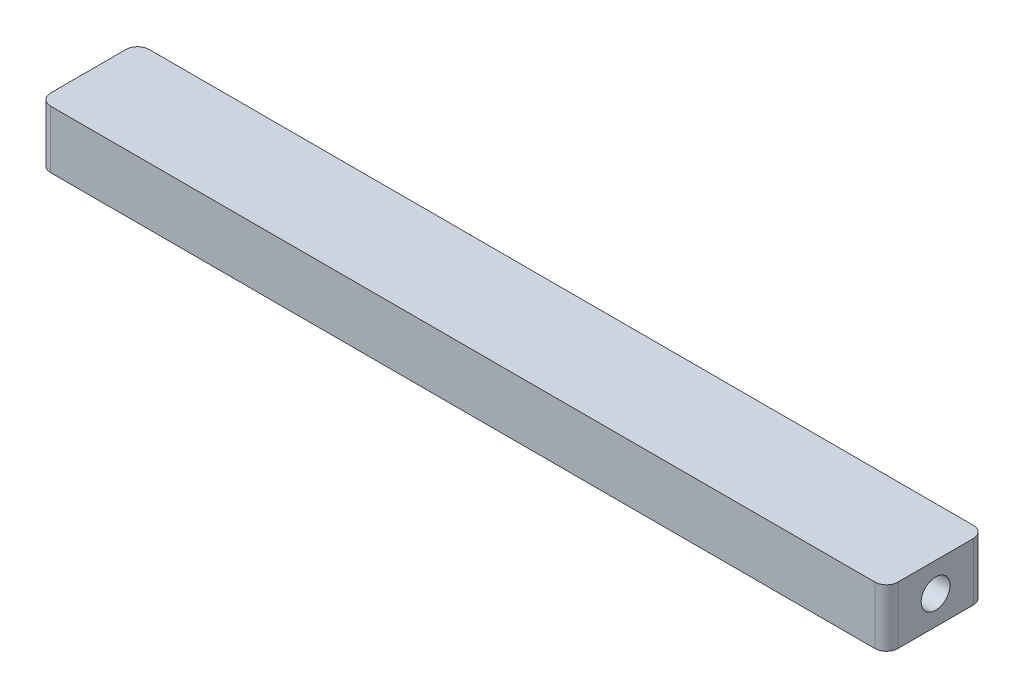
ISO-10303-21;
HEADER;
FILE_DESCRIPTION(('STEP AP214'),'2;1');
FILE_NAME('part.step','',(''),(''),'','','');
FILE_SCHEMA(('AUTOMOTIVE_DESIGN { 1 0 10303 214 1 1 1 1 }'));
ENDSEC;
DATA;
#1=APPLICATION_CONTEXT('core data for automotive mechanical design processes');
#2=APPLICATION_PROTOCOL_DEFINITION('international standard','automotive_design',2000,#1);
#3=PRODUCT_CONTEXT('',#1,'mechanical');
#4=PRODUCT('Part','Part','',(#3));
#5=PRODUCT_RELATED_PRODUCT_CATEGORY('part','',(#4));
#6=PRODUCT_DEFINITION_FORMATION('','',#4);
#7=PRODUCT_DEFINITION_CONTEXT('part definition',#1,'design');
#8=PRODUCT_DEFINITION('design','',#6,#7);
#9=PRODUCT_DEFINITION_SHAPE('','',#8);
#10=(LENGTH_UNIT() NAMED_UNIT(*) SI_UNIT(.MILLI.,.METRE.));
#11=(NAMED_UNIT(*) PLANE_ANGLE_UNIT() SI_UNIT($,.RADIAN.));
#12=(NAMED_UNIT(*) SI_UNIT($,.STERADIAN.) SOLID_ANGLE_UNIT());
#13=UNCERTAINTY_MEASURE_WITH_UNIT(LENGTH_MEASURE(1.E-05),#10,'distance_accuracy_value','');
#14=(GEOMETRIC_REPRESENTATION_CONTEXT(3) GLOBAL_UNCERTAINTY_ASSIGNED_CONTEXT((#13)) GLOBAL_UNIT_ASSIGNED_CONTEXT((#10,
#11,#12)) REPRESENTATION_CONTEXT('',''));
#15=CARTESIAN_POINT('',(0.,0.,0.));
#16=DIRECTION('',(0.,0.,1.));
#17=DIRECTION('',(1.,0.,0.));
#18=AXIS2_PLACEMENT_3D('',#15,#16,#17);
#19=CARTESIAN_POINT('',(94.3013227790023,10.,-32.2251416702218));
#20=DIRECTION('',(0.,-1.,0.));
#21=DIRECTION('',(0.,0.,-1.));
#22=AXIS2_PLACEMENT_3D('',#19,#20,#21);
#23=CYLINDRICAL_SURFACE('',#22,2.);
#24=CARTESIAN_POINT('',(94.3013227790023,0.,-32.2251416702218));
#25=DIRECTION('',(0.,1.,0.));
#26=DIRECTION('',(0.,0.,1.));
#27=AXIS2_PLACEMENT_3D('',#24,#25,#26);
#28=CIRCLE('',#27,2.);
#29=CARTESIAN_POINT('',(96.3013227790023,0.,-32.2251416702218));
#30=VERTEX_POINT('',#29);
#31=CARTESIAN_POINT('',(94.3013227790023,0.,-34.2251416702218));
#32=VERTEX_POINT('',#31);
#33=EDGE_CURVE('E129',#30,#32,#28,.T.);
#34=ORIENTED_EDGE('',*,*,#33,.T.);
#35=DIRECTION('',(0.,-1.,0.));
#36=VECTOR('',#35,1.);
#37=CARTESIAN_POINT('',(94.3013227790023,10.,-34.2251416702218));
#38=LINE('',#37,#36);
#39=CARTESIAN_POINT('',(94.3013227790023,10.,-34.2251416702218));
#40=VERTEX_POINT('',#39);
#41=EDGE_CURVE('E11',#40,#32,#38,.T.);
#42=ORIENTED_EDGE('',*,*,#41,.F.);
#43=CARTESIAN_POINT('',(94.3013227790023,10.,-32.2251416702218));
#44=DIRECTION('',(0.,1.,0.));
#45=DIRECTION('',(0.,0.,1.));
#46=AXIS2_PLACEMENT_3D('',#43,#44,#45);
#47=CIRCLE('',#46,2.);
#48=CARTESIAN_POINT('',(96.3013227790023,10.,-32.2251416702218));
#49=VERTEX_POINT('',#48);
#50=EDGE_CURVE('E144',#49,#40,#47,.T.);
#51=ORIENTED_EDGE('',*,*,#50,.F.);
#52=DIRECTION('',(0.,-1.,0.));
#53=VECTOR('',#52,1.);
#54=CARTESIAN_POINT('',(96.3013227790023,10.,-32.2251416702218));
#55=LINE('',#54,#53);
#56=EDGE_CURVE('E125',#49,#30,#55,.T.);
#57=ORIENTED_EDGE('',*,*,#56,.T.);
#58=EDGE_LOOP('',(#34,#42,#51,#57));
#59=FACE_BOUND('',#58,.T.);
#60=ADVANCED_FACE('F33',(#59),#23,.T.);
#61=CARTESIAN_POINT('',(-48.7697450328632,10.,-34.2251416702218));
#62=DIRECTION('',(0.,0.,1.));
#63=DIRECTION('',(1.,0.,0.));
#64=AXIS2_PLACEMENT_3D('',#61,#62,#63);
#65=PLANE('',#64);
#66=DIRECTION('',(-1.,0.,0.));
#67=VECTOR('',#66,1.);
#68=CARTESIAN_POINT('',(-48.7697450328632,0.,-34.2251416702218));
#69=LINE('',#68,#67);
#70=CARTESIAN_POINT('',(-48.7697450328632,0.,-34.2251416702218));
#71=VERTEX_POINT('',#70);
#72=EDGE_CURVE('E132',#32,#71,#69,.T.);
#73=ORIENTED_EDGE('',*,*,#72,.T.);
#74=DIRECTION('',(0.,-1.,0.));
#75=VECTOR('',#74,1.);
#76=CARTESIAN_POINT('',(-48.7697450328632,10.,-34.2251416702218));
#77=LINE('',#76,#75);
#78=CARTESIAN_POINT('',(-48.7697450328632,10.,-34.2251416702218));
#79=VERTEX_POINT('',#78);
#80=EDGE_CURVE('E41',#79,#71,#77,.T.);
#81=ORIENTED_EDGE('',*,*,#80,.F.);
#82=DIRECTION('',(-1.,0.,0.));
#83=VECTOR('',#82,1.);
#84=CARTESIAN_POINT('',(-48.7697450328632,10.,-34.2251416702218));
#85=LINE('',#84,#83);
#86=EDGE_CURVE('E92',#40,#79,#85,.T.);
#87=ORIENTED_EDGE('',*,*,#86,.F.);
#88=ORIENTED_EDGE('',*,*,#41,.T.);
#89=EDGE_LOOP('',(#73,#81,#87,#88));
#90=FACE_BOUND('',#89,.T.);
#91=ADVANCED_FACE('F197',(#90),#65,.F.);
#92=CARTESIAN_POINT('',(-48.7697450328632,10.,-32.2251416702218));
#93=DIRECTION('',(0.,-1.,0.));
#94=DIRECTION('',(0.,0.,-1.));
#95=AXIS2_PLACEMENT_3D('',#92,#93,#94);
#96=CYLINDRICAL_SURFACE('',#95,2.);
#97=CARTESIAN_POINT('',(-48.7697450328632,0.,-32.2251416702218));
#98=DIRECTION('',(0.,1.,0.));
#99=DIRECTION('',(0.,0.,-1.));
#100=AXIS2_PLACEMENT_3D('',#97,#98,#99);
#101=CIRCLE('',#100,2.);
#102=CARTESIAN_POINT('',(-50.7697450328632,0.,-32.2251416702218));
#103=VERTEX_POINT('',#102);
#104=EDGE_CURVE('E135',#71,#103,#101,.T.);
#105=ORIENTED_EDGE('',*,*,#104,.T.);
#106=DIRECTION('',(0.,-1.,0.));
#107=VECTOR('',#106,1.);
#108=CARTESIAN_POINT('',(-50.7697450328632,10.,-32.2251416702218));
#109=LINE('',#108,#107);
#110=CARTESIAN_POINT('',(-50.7697450328632,10.,-32.2251416702218));
#111=VERTEX_POINT('',#110);
#112=EDGE_CURVE('E151',#111,#103,#109,.T.);
#113=ORIENTED_EDGE('',*,*,#112,.F.);
#114=CARTESIAN_POINT('',(-48.7697450328632,10.,-32.2251416702218));
#115=DIRECTION('',(0.,1.,0.));
#116=DIRECTION('',(0.,0.,-1.));
#117=AXIS2_PLACEMENT_3D('',#114,#115,#116);
#118=CIRCLE('',#117,2.);
#119=EDGE_CURVE('E159',#79,#111,#118,.T.);
#120=ORIENTED_EDGE('',*,*,#119,.F.);
#121=ORIENTED_EDGE('',*,*,#80,.T.);
#122=EDGE_LOOP('',(#105,#113,#120,#121));
#123=FACE_BOUND('',#122,.T.);
#124=ADVANCED_FACE('F157',(#123),#96,.T.);
#125=CARTESIAN_POINT('',(-50.7697450328632,10.,-19.1540738583563));
#126=DIRECTION('',(1.,0.,0.));
#127=DIRECTION('',(0.,0.,-1.));
#128=AXIS2_PLACEMENT_3D('',#125,#126,#127);
#129=PLANE('',#128);
#130=CARTESIAN_POINT('',(-50.7697450328632,5.,-25.689607764289));
#131=DIRECTION('',(1.,0.,0.));
#132=DIRECTION('',(0.,0.,-1.));
#133=AXIS2_PLACEMENT_3D('',#130,#131,#132);
#134=CIRCLE('',#133,2.5);
#135=CARTESIAN_POINT('',(-50.7697450328632,5.,-28.189607764289));
#136=VERTEX_POINT('',#135);
#137=EDGE_CURVE('E133',#136,#136,#134,.T.);
#138=ORIENTED_EDGE('',*,*,#137,.T.);
#139=EDGE_LOOP('',(#138));
#140=FACE_BOUND('',#139,.T.);
#141=DIRECTION('',(0.,0.,1.));
#142=VECTOR('',#141,1.);
#143=CARTESIAN_POINT('',(-50.7697450328632,0.,-19.1540738583563));
#144=LINE('',#143,#142);
#145=CARTESIAN_POINT('',(-50.7697450328632,0.,-19.1540738583563));
#146=VERTEX_POINT('',#145);
#147=EDGE_CURVE('E137',#103,#146,#144,.T.);
#148=ORIENTED_EDGE('',*,*,#147,.T.);
#149=DIRECTION('',(0.,-1.,0.));
#150=VECTOR('',#149,1.);
#151=CARTESIAN_POINT('',(-50.7697450328632,10.,-19.1540738583563));
#152=LINE('',#151,#150);
#153=CARTESIAN_POINT('',(-50.7697450328632,10.,-19.1540738583563));
#154=VERTEX_POINT('',#153);
#155=EDGE_CURVE('E148',#154,#146,#152,.T.);
#156=ORIENTED_EDGE('',*,*,#155,.F.);
#157=DIRECTION('',(0.,0.,1.));
#158=VECTOR('',#157,1.);
#159=CARTESIAN_POINT('',(-50.7697450328632,10.,-19.1540738583563));
#160=LINE('',#159,#158);
#161=EDGE_CURVE('E171',#111,#154,#160,.T.);
#162=ORIENTED_EDGE('',*,*,#161,.F.);
#163=ORIENTED_EDGE('',*,*,#112,.T.);
#164=EDGE_LOOP('',(#148,#156,#162,#163));
#165=FACE_BOUND('',#164,.T.);
#166=ADVANCED_FACE('F167',(#140,#165),#129,.F.);
#167=CARTESIAN_POINT('',(-48.7697450328632,10.,-19.1540738583563));
#168=DIRECTION('',(0.,-1.,0.));
#169=DIRECTION('',(0.,0.,-1.));
#170=AXIS2_PLACEMENT_3D('',#167,#168,#169);
#171=CYLINDRICAL_SURFACE('',#170,2.);
#172=CARTESIAN_POINT('',(-48.7697450328632,0.,-19.1540738583563));
#173=DIRECTION('',(0.,1.,0.));
#174=DIRECTION('',(0.,0.,1.));
#175=AXIS2_PLACEMENT_3D('',#172,#173,#174);
#176=CIRCLE('',#175,2.);
#177=CARTESIAN_POINT('',(-48.7697450328632,0.,-17.1540738583563));
#178=VERTEX_POINT('',#177);
#179=EDGE_CURVE('E139',#146,#178,#176,.T.);
#180=ORIENTED_EDGE('',*,*,#179,.T.);
#181=DIRECTION('',(0.,-1.,0.));
#182=VECTOR('',#181,1.);
#183=CARTESIAN_POINT('',(-48.7697450328632,10.,-17.1540738583563));
#184=LINE('',#183,#182);
#185=CARTESIAN_POINT('',(-48.7697450328632,10.,-17.1540738583563));
#186=VERTEX_POINT('',#185);
#187=EDGE_CURVE('E120',#186,#178,#184,.T.);
#188=ORIENTED_EDGE('',*,*,#187,.F.);
#189=CARTESIAN_POINT('',(-48.7697450328632,10.,-19.1540738583563));
#190=DIRECTION('',(0.,1.,0.));
#191=DIRECTION('',(0.,0.,1.));
#192=AXIS2_PLACEMENT_3D('',#189,#190,#191);
#193=CIRCLE('',#192,2.);
#194=EDGE_CURVE('E111',#154,#186,#193,.T.);
#195=ORIENTED_EDGE('',*,*,#194,.F.);
#196=ORIENTED_EDGE('',*,*,#155,.T.);
#197=EDGE_LOOP('',(#180,#188,#195,#196));
#198=FACE_BOUND('',#197,.T.);
#199=ADVANCED_FACE('F170',(#198),#171,.T.);
#200=CARTESIAN_POINT('',(94.3013227790023,10.,-17.1540738583563));
#201=DIRECTION('',(0.,0.,-1.));
#202=DIRECTION('',(-1.,0.,0.));
#203=AXIS2_PLACEMENT_3D('',#200,#201,#202);
#204=PLANE('',#203);
#205=DIRECTION('',(1.,0.,0.));
#206=VECTOR('',#205,1.);
#207=CARTESIAN_POINT('',(94.3013227790023,0.,-17.1540738583563));
#208=LINE('',#207,#206);
#209=CARTESIAN_POINT('',(94.3013227790023,0.,-17.1540738583563));
#210=VERTEX_POINT('',#209);
#211=EDGE_CURVE('E119',#178,#210,#208,.T.);
#212=ORIENTED_EDGE('',*,*,#211,.T.);
#213=DIRECTION('',(0.,-1.,0.));
#214=VECTOR('',#213,1.);
#215=CARTESIAN_POINT('',(94.3013227790023,10.,-17.1540738583563));
#216=LINE('',#215,#214);
#217=CARTESIAN_POINT('',(94.3013227790023,10.,-17.1540738583563));
#218=VERTEX_POINT('',#217);
#219=EDGE_CURVE('E116',#218,#210,#216,.T.);
#220=ORIENTED_EDGE('',*,*,#219,.F.);
#221=DIRECTION('',(1.,0.,0.));
#222=VECTOR('',#221,1.);
#223=CARTESIAN_POINT('',(94.3013227790023,10.,-17.1540738583563));
#224=LINE('',#223,#222);
#225=EDGE_CURVE('E105',#186,#218,#224,.T.);
#226=ORIENTED_EDGE('',*,*,#225,.F.);
#227=ORIENTED_EDGE('',*,*,#187,.T.);
#228=EDGE_LOOP('',(#212,#220,#226,#227));
#229=FACE_BOUND('',#228,.T.);
#230=ADVANCED_FACE('F117',(#229),#204,.F.);
#231=CARTESIAN_POINT('',(94.3013227790023,10.,-19.1540738583563));
#232=DIRECTION('',(0.,-1.,0.));
#233=DIRECTION('',(0.,0.,-1.));
#234=AXIS2_PLACEMENT_3D('',#231,#232,#233);
#235=CYLINDRICAL_SURFACE('',#234,2.);
#236=CARTESIAN_POINT('',(94.3013227790023,0.,-19.1540738583563));
#237=DIRECTION('',(0.,1.,0.));
#238=DIRECTION('',(0.,0.,-1.));
#239=AXIS2_PLACEMENT_3D('',#236,#237,#238);
#240=CIRCLE('',#239,2.);
#241=CARTESIAN_POINT('',(96.3013227790023,0.,-19.1540738583563));
#242=VERTEX_POINT('',#241);
#243=EDGE_CURVE('E78',#210,#242,#240,.T.);
#244=ORIENTED_EDGE('',*,*,#243,.T.);
#245=DIRECTION('',(0.,-1.,0.));
#246=VECTOR('',#245,1.);
#247=CARTESIAN_POINT('',(96.3013227790023,10.,-19.1540738583563));
#248=LINE('',#247,#246);
#249=CARTESIAN_POINT('',(96.3013227790023,10.,-19.1540738583563));
#250=VERTEX_POINT('',#249);
#251=EDGE_CURVE('E121',#250,#242,#248,.T.);
#252=ORIENTED_EDGE('',*,*,#251,.F.);
#253=CARTESIAN_POINT('',(94.3013227790023,10.,-19.1540738583563));
#254=DIRECTION('',(0.,1.,0.));
#255=DIRECTION('',(0.,0.,-1.));
#256=AXIS2_PLACEMENT_3D('',#253,#254,#255);
#257=CIRCLE('',#256,2.);
#258=EDGE_CURVE('E109',#218,#250,#257,.T.);
#259=ORIENTED_EDGE('',*,*,#258,.F.);
#260=ORIENTED_EDGE('',*,*,#219,.T.);
#261=EDGE_LOOP('',(#244,#252,#259,#260));
#262=FACE_BOUND('',#261,.T.);
#263=ADVANCED_FACE('F123',(#262),#235,.T.);
#264=CARTESIAN_POINT('',(96.3013227790023,10.,-32.2251416702218));
#265=DIRECTION('',(-1.,0.,0.));
#266=DIRECTION('',(0.,0.,1.));
#267=AXIS2_PLACEMENT_3D('',#264,#265,#266);
#268=PLANE('',#267);
#269=CARTESIAN_POINT('',(96.3013227790023,5.,-25.689607764289));
#270=DIRECTION('',(1.,0.,0.));
#271=DIRECTION('',(0.,0.,-1.));
#272=AXIS2_PLACEMENT_3D('',#269,#270,#271);
#273=CIRCLE('',#272,2.5);
#274=CARTESIAN_POINT('',(96.3013227790023,5.,-28.189607764289));
#275=VERTEX_POINT('',#274);
#276=EDGE_CURVE('E179',#275,#275,#273,.T.);
#277=ORIENTED_EDGE('',*,*,#276,.F.);
#278=EDGE_LOOP('',(#277));
#279=FACE_BOUND('',#278,.T.);
#280=DIRECTION('',(0.,0.,-1.));
#281=VECTOR('',#280,1.);
#282=CARTESIAN_POINT('',(96.3013227790023,0.,-32.2251416702218));
#283=LINE('',#282,#281);
#284=EDGE_CURVE('E84',#242,#30,#283,.T.);
#285=ORIENTED_EDGE('',*,*,#284,.T.);
#286=ORIENTED_EDGE('',*,*,#56,.F.);
#287=DIRECTION('',(0.,0.,-1.));
#288=VECTOR('',#287,1.);
#289=CARTESIAN_POINT('',(96.3013227790023,10.,-32.2251416702218));
#290=LINE('',#289,#288);
#291=EDGE_CURVE('E49',#250,#49,#290,.T.);
#292=ORIENTED_EDGE('',*,*,#291,.F.);
#293=ORIENTED_EDGE('',*,*,#251,.T.);
#294=EDGE_LOOP('',(#285,#286,#292,#293));
#295=FACE_BOUND('',#294,.T.);
#296=ADVANCED_FACE('F186',(#279,#295),#268,.F.);
#297=CARTESIAN_POINT('',(94.3013227790023,10.,-32.2251416702218));
#298=DIRECTION('',(0.,1.,0.));
#299=DIRECTION('',(0.,0.,1.));
#300=AXIS2_PLACEMENT_3D('',#297,#298,#299);
#301=PLANE('',#300);
#302=ORIENTED_EDGE('',*,*,#50,.T.);
#303=ORIENTED_EDGE('',*,*,#86,.T.);
#304=ORIENTED_EDGE('',*,*,#119,.T.);
#305=ORIENTED_EDGE('',*,*,#161,.T.);
#306=ORIENTED_EDGE('',*,*,#194,.T.);
#307=ORIENTED_EDGE('',*,*,#225,.T.);
#308=ORIENTED_EDGE('',*,*,#258,.T.);
#309=ORIENTED_EDGE('',*,*,#291,.T.);
#310=EDGE_LOOP('',(#302,#303,#304,#305,#306,#307,#308,#309));
#311=FACE_BOUND('',#310,.T.);
#312=ADVANCED_FACE('F107',(#311),#301,.T.);
#313=CARTESIAN_POINT('',(94.3013227790023,0.,-32.2251416702218));
#314=DIRECTION('',(0.,1.,0.));
#315=DIRECTION('',(0.,0.,1.));
#316=AXIS2_PLACEMENT_3D('',#313,#314,#315);
#317=PLANE('',#316);
#318=ORIENTED_EDGE('',*,*,#33,.F.);
#319=ORIENTED_EDGE('',*,*,#284,.F.);
#320=ORIENTED_EDGE('',*,*,#243,.F.);
#321=ORIENTED_EDGE('',*,*,#211,.F.);
#322=ORIENTED_EDGE('',*,*,#179,.F.);
#323=ORIENTED_EDGE('',*,*,#147,.F.);
#324=ORIENTED_EDGE('',*,*,#104,.F.);
#325=ORIENTED_EDGE('',*,*,#72,.F.);
#326=EDGE_LOOP('',(#318,#319,#320,#321,#322,#323,#324,#325));
#327=FACE_BOUND('',#326,.T.);
#328=ADVANCED_FACE('F163',(#327),#317,.F.);
#329=CARTESIAN_POINT('',(-73.6986772209978,5.,-25.689607764289));
#330=DIRECTION('',(1.,0.,0.));
#331=DIRECTION('',(0.,0.,-1.));
#332=AXIS2_PLACEMENT_3D('',#329,#330,#331);
#333=CYLINDRICAL_SURFACE('',#332,2.5);
#334=ORIENTED_EDGE('',*,*,#276,.T.);
#335=EDGE_LOOP('',(#334));
#336=FACE_BOUND('',#335,.T.);
#337=ORIENTED_EDGE('',*,*,#137,.F.);
#338=EDGE_LOOP('',(#337));
#339=FACE_BOUND('',#338,.T.);
#340=ADVANCED_FACE('F183',(#336,#339),#333,.F.);
#341=CLOSED_SHELL('',(#60,#91,#124,#166,#199,#230,#263,#296,#312,#328,#340));
#342=MANIFOLD_SOLID_BREP('B2',#341);
#343=ADVANCED_BREP_SHAPE_REPRESENTATION('',(#18,#342),#14);
#344=SHAPE_DEFINITION_REPRESENTATION(#9,#343);
ENDSEC;
END-ISO-10303-21;
